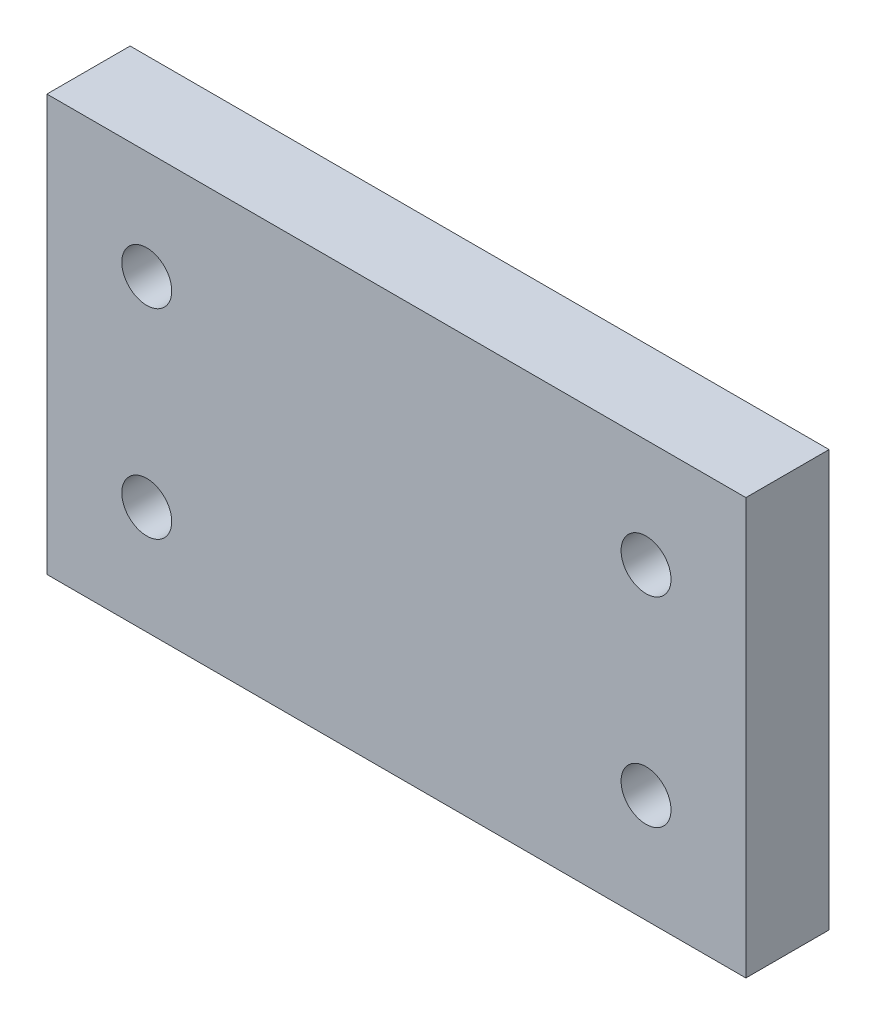
ISO-10303-21;
HEADER;
FILE_DESCRIPTION(('STEP AP214'),'2;1');
FILE_NAME('part.step','',(''),(''),'','','');
FILE_SCHEMA(('AUTOMOTIVE_DESIGN { 1 0 10303 214 1 1 1 1 }'));
ENDSEC;
DATA;
#1=APPLICATION_CONTEXT('core data for automotive mechanical design processes');
#2=APPLICATION_PROTOCOL_DEFINITION('international standard','automotive_design',2000,#1);
#3=PRODUCT_CONTEXT('',#1,'mechanical');
#4=PRODUCT('Part','Part','',(#3));
#5=PRODUCT_RELATED_PRODUCT_CATEGORY('part','',(#4));
#6=PRODUCT_DEFINITION_FORMATION('','',#4);
#7=PRODUCT_DEFINITION_CONTEXT('part definition',#1,'design');
#8=PRODUCT_DEFINITION('design','',#6,#7);
#9=PRODUCT_DEFINITION_SHAPE('','',#8);
#10=(LENGTH_UNIT() NAMED_UNIT(*) SI_UNIT(.MILLI.,.METRE.));
#11=(NAMED_UNIT(*) PLANE_ANGLE_UNIT() SI_UNIT($,.RADIAN.));
#12=(NAMED_UNIT(*) SI_UNIT($,.STERADIAN.) SOLID_ANGLE_UNIT());
#13=UNCERTAINTY_MEASURE_WITH_UNIT(LENGTH_MEASURE(1.E-05),#10,'distance_accuracy_value','');
#14=(GEOMETRIC_REPRESENTATION_CONTEXT(3) GLOBAL_UNCERTAINTY_ASSIGNED_CONTEXT((#13)) GLOBAL_UNIT_ASSIGNED_CONTEXT((#10,
#11,#12)) REPRESENTATION_CONTEXT('',''));
#15=CARTESIAN_POINT('',(0.,0.,0.));
#16=DIRECTION('',(0.,0.,1.));
#17=DIRECTION('',(1.,0.,0.));
#18=AXIS2_PLACEMENT_3D('',#15,#16,#17);
#19=CARTESIAN_POINT('',(0.,0.,5.));
#20=DIRECTION('',(0.,0.,1.));
#21=DIRECTION('',(1.,0.,0.));
#22=AXIS2_PLACEMENT_3D('',#19,#20,#21);
#23=PLANE('',#22);
#24=CARTESIAN_POINT('',(-15.,-6.,5.));
#25=DIRECTION('',(0.,0.,1.));
#26=DIRECTION('',(1.,0.,0.));
#27=AXIS2_PLACEMENT_3D('',#24,#25,#26);
#28=CIRCLE('',#27,1.5);
#29=CARTESIAN_POINT('',(-13.5,-6.,5.));
#30=VERTEX_POINT('',#29);
#31=EDGE_CURVE('E148',#30,#30,#28,.T.);
#32=ORIENTED_EDGE('',*,*,#31,.F.);
#33=EDGE_LOOP('',(#32));
#34=FACE_BOUND('',#33,.T.);
#35=CARTESIAN_POINT('',(15.,6.,5.));
#36=DIRECTION('',(0.,0.,1.));
#37=DIRECTION('',(1.,0.,0.));
#38=AXIS2_PLACEMENT_3D('',#35,#36,#37);
#39=CIRCLE('',#38,1.5);
#40=CARTESIAN_POINT('',(16.5,6.,5.));
#41=VERTEX_POINT('',#40);
#42=EDGE_CURVE('E118',#41,#41,#39,.T.);
#43=ORIENTED_EDGE('',*,*,#42,.F.);
#44=EDGE_LOOP('',(#43));
#45=FACE_BOUND('',#44,.T.);
#46=DIRECTION('',(0.,-1.,0.));
#47=VECTOR('',#46,1.);
#48=CARTESIAN_POINT('',(-21.,-12.5,5.));
#49=LINE('',#48,#47);
#50=CARTESIAN_POINT('',(-21.,12.5,5.));
#51=VERTEX_POINT('',#50);
#52=CARTESIAN_POINT('',(-21.,-12.5,5.));
#53=VERTEX_POINT('',#52);
#54=EDGE_CURVE('E98',#51,#53,#49,.T.);
#55=ORIENTED_EDGE('',*,*,#54,.T.);
#56=DIRECTION('',(1.,0.,0.));
#57=VECTOR('',#56,1.);
#58=CARTESIAN_POINT('',(21.,-12.5,5.));
#59=LINE('',#58,#57);
#60=CARTESIAN_POINT('',(21.,-12.5,5.));
#61=VERTEX_POINT('',#60);
#62=EDGE_CURVE('E93',#53,#61,#59,.T.);
#63=ORIENTED_EDGE('',*,*,#62,.T.);
#64=DIRECTION('',(0.,1.,0.));
#65=VECTOR('',#64,1.);
#66=CARTESIAN_POINT('',(21.,-12.5,5.));
#67=LINE('',#66,#65);
#68=CARTESIAN_POINT('',(21.,12.5,5.));
#69=VERTEX_POINT('',#68);
#70=EDGE_CURVE('E96',#61,#69,#67,.T.);
#71=ORIENTED_EDGE('',*,*,#70,.T.);
#72=DIRECTION('',(-1.,0.,0.));
#73=VECTOR('',#72,1.);
#74=CARTESIAN_POINT('',(21.,12.5,5.));
#75=LINE('',#74,#73);
#76=EDGE_CURVE('E63',#69,#51,#75,.T.);
#77=ORIENTED_EDGE('',*,*,#76,.T.);
#78=EDGE_LOOP('',(#55,#63,#71,#77));
#79=FACE_BOUND('',#78,.T.);
#80=CARTESIAN_POINT('',(15.,-6.,5.));
#81=DIRECTION('',(0.,0.,1.));
#82=DIRECTION('',(1.,0.,0.));
#83=AXIS2_PLACEMENT_3D('',#80,#81,#82);
#84=CIRCLE('',#83,1.5);
#85=CARTESIAN_POINT('',(16.5,-6.,5.));
#86=VERTEX_POINT('',#85);
#87=EDGE_CURVE('E140',#86,#86,#84,.T.);
#88=ORIENTED_EDGE('',*,*,#87,.F.);
#89=EDGE_LOOP('',(#88));
#90=FACE_BOUND('',#89,.T.);
#91=CARTESIAN_POINT('',(-15.,6.,5.));
#92=DIRECTION('',(0.,0.,1.));
#93=DIRECTION('',(1.,0.,0.));
#94=AXIS2_PLACEMENT_3D('',#91,#92,#93);
#95=CIRCLE('',#94,1.5);
#96=CARTESIAN_POINT('',(-13.5,6.,5.));
#97=VERTEX_POINT('',#96);
#98=EDGE_CURVE('E156',#97,#97,#95,.T.);
#99=ORIENTED_EDGE('',*,*,#98,.F.);
#100=EDGE_LOOP('',(#99));
#101=FACE_BOUND('',#100,.T.);
#102=ADVANCED_FACE('F45',(#34,#45,#79,#90,#101),#23,.T.);
#103=CARTESIAN_POINT('',(0.,0.,0.));
#104=DIRECTION('',(0.,0.,1.));
#105=DIRECTION('',(1.,0.,0.));
#106=AXIS2_PLACEMENT_3D('',#103,#104,#105);
#107=PLANE('',#106);
#108=DIRECTION('',(0.,-1.,0.));
#109=VECTOR('',#108,1.);
#110=CARTESIAN_POINT('',(-21.,-12.5,0.));
#111=LINE('',#110,#109);
#112=CARTESIAN_POINT('',(-21.,12.5,0.));
#113=VERTEX_POINT('',#112);
#114=CARTESIAN_POINT('',(-21.,-12.5,0.));
#115=VERTEX_POINT('',#114);
#116=EDGE_CURVE('E114',#113,#115,#111,.T.);
#117=ORIENTED_EDGE('',*,*,#116,.F.);
#118=DIRECTION('',(-1.,0.,0.));
#119=VECTOR('',#118,1.);
#120=CARTESIAN_POINT('',(21.,12.5,0.));
#121=LINE('',#120,#119);
#122=CARTESIAN_POINT('',(21.,12.5,0.));
#123=VERTEX_POINT('',#122);
#124=EDGE_CURVE('E86',#123,#113,#121,.T.);
#125=ORIENTED_EDGE('',*,*,#124,.F.);
#126=DIRECTION('',(0.,1.,0.));
#127=VECTOR('',#126,1.);
#128=CARTESIAN_POINT('',(21.,-12.5,0.));
#129=LINE('',#128,#127);
#130=CARTESIAN_POINT('',(21.,-12.5,0.));
#131=VERTEX_POINT('',#130);
#132=EDGE_CURVE('E80',#131,#123,#129,.T.);
#133=ORIENTED_EDGE('',*,*,#132,.F.);
#134=DIRECTION('',(1.,0.,0.));
#135=VECTOR('',#134,1.);
#136=CARTESIAN_POINT('',(21.,-12.5,0.));
#137=LINE('',#136,#135);
#138=EDGE_CURVE('E103',#115,#131,#137,.T.);
#139=ORIENTED_EDGE('',*,*,#138,.F.);
#140=EDGE_LOOP('',(#117,#125,#133,#139));
#141=FACE_BOUND('',#140,.T.);
#142=CARTESIAN_POINT('',(15.,6.,0.));
#143=DIRECTION('',(0.,0.,1.));
#144=DIRECTION('',(1.,0.,0.));
#145=AXIS2_PLACEMENT_3D('',#142,#143,#144);
#146=CIRCLE('',#145,1.5);
#147=CARTESIAN_POINT('',(16.5,6.,0.));
#148=VERTEX_POINT('',#147);
#149=EDGE_CURVE('E136',#148,#148,#146,.T.);
#150=ORIENTED_EDGE('',*,*,#149,.T.);
#151=EDGE_LOOP('',(#150));
#152=FACE_BOUND('',#151,.T.);
#153=CARTESIAN_POINT('',(15.,-6.,0.));
#154=DIRECTION('',(0.,0.,1.));
#155=DIRECTION('',(1.,0.,0.));
#156=AXIS2_PLACEMENT_3D('',#153,#154,#155);
#157=CIRCLE('',#156,1.5);
#158=CARTESIAN_POINT('',(16.5,-6.,0.));
#159=VERTEX_POINT('',#158);
#160=EDGE_CURVE('E144',#159,#159,#157,.T.);
#161=ORIENTED_EDGE('',*,*,#160,.T.);
#162=EDGE_LOOP('',(#161));
#163=FACE_BOUND('',#162,.T.);
#164=CARTESIAN_POINT('',(-15.,-6.,0.));
#165=DIRECTION('',(0.,0.,1.));
#166=DIRECTION('',(1.,0.,0.));
#167=AXIS2_PLACEMENT_3D('',#164,#165,#166);
#168=CIRCLE('',#167,1.5);
#169=CARTESIAN_POINT('',(-13.5,-6.,0.));
#170=VERTEX_POINT('',#169);
#171=EDGE_CURVE('E152',#170,#170,#168,.T.);
#172=ORIENTED_EDGE('',*,*,#171,.T.);
#173=EDGE_LOOP('',(#172));
#174=FACE_BOUND('',#173,.T.);
#175=CARTESIAN_POINT('',(-15.,6.,0.));
#176=DIRECTION('',(0.,0.,1.));
#177=DIRECTION('',(1.,0.,0.));
#178=AXIS2_PLACEMENT_3D('',#175,#176,#177);
#179=CIRCLE('',#178,1.5);
#180=CARTESIAN_POINT('',(-13.5,6.,0.));
#181=VERTEX_POINT('',#180);
#182=EDGE_CURVE('E160',#181,#181,#179,.T.);
#183=ORIENTED_EDGE('',*,*,#182,.T.);
#184=EDGE_LOOP('',(#183));
#185=FACE_BOUND('',#184,.T.);
#186=ADVANCED_FACE('F131',(#141,#152,#163,#174,#185),#107,.F.);
#187=CARTESIAN_POINT('',(-21.,-12.5,5.));
#188=DIRECTION('',(1.,0.,0.));
#189=DIRECTION('',(0.,0.,-1.));
#190=AXIS2_PLACEMENT_3D('',#187,#188,#189);
#191=PLANE('',#190);
#192=ORIENTED_EDGE('',*,*,#116,.T.);
#193=DIRECTION('',(0.,0.,-1.));
#194=VECTOR('',#193,1.);
#195=CARTESIAN_POINT('',(-21.,-12.5,5.));
#196=LINE('',#195,#194);
#197=EDGE_CURVE('E11',#53,#115,#196,.T.);
#198=ORIENTED_EDGE('',*,*,#197,.F.);
#199=ORIENTED_EDGE('',*,*,#54,.F.);
#200=DIRECTION('',(0.,0.,-1.));
#201=VECTOR('',#200,1.);
#202=CARTESIAN_POINT('',(-21.,12.5,5.));
#203=LINE('',#202,#201);
#204=EDGE_CURVE('E110',#51,#113,#203,.T.);
#205=ORIENTED_EDGE('',*,*,#204,.T.);
#206=EDGE_LOOP('',(#192,#198,#199,#205));
#207=FACE_BOUND('',#206,.T.);
#208=ADVANCED_FACE('F47',(#207),#191,.F.);
#209=CARTESIAN_POINT('',(21.,-12.5,5.));
#210=DIRECTION('',(0.,1.,0.));
#211=DIRECTION('',(-1.,0.,0.));
#212=AXIS2_PLACEMENT_3D('',#209,#210,#211);
#213=PLANE('',#212);
#214=ORIENTED_EDGE('',*,*,#138,.T.);
#215=DIRECTION('',(0.,0.,-1.));
#216=VECTOR('',#215,1.);
#217=CARTESIAN_POINT('',(21.,-12.5,5.));
#218=LINE('',#217,#216);
#219=EDGE_CURVE('E55',#61,#131,#218,.T.);
#220=ORIENTED_EDGE('',*,*,#219,.F.);
#221=ORIENTED_EDGE('',*,*,#62,.F.);
#222=ORIENTED_EDGE('',*,*,#197,.T.);
#223=EDGE_LOOP('',(#214,#220,#221,#222));
#224=FACE_BOUND('',#223,.T.);
#225=ADVANCED_FACE('F102',(#224),#213,.F.);
#226=CARTESIAN_POINT('',(21.,-12.5,5.));
#227=DIRECTION('',(-1.,0.,0.));
#228=DIRECTION('',(0.,0.,1.));
#229=AXIS2_PLACEMENT_3D('',#226,#227,#228);
#230=PLANE('',#229);
#231=ORIENTED_EDGE('',*,*,#132,.T.);
#232=DIRECTION('',(0.,0.,-1.));
#233=VECTOR('',#232,1.);
#234=CARTESIAN_POINT('',(21.,12.5,5.));
#235=LINE('',#234,#233);
#236=EDGE_CURVE('E105',#69,#123,#235,.T.);
#237=ORIENTED_EDGE('',*,*,#236,.F.);
#238=ORIENTED_EDGE('',*,*,#70,.F.);
#239=ORIENTED_EDGE('',*,*,#219,.T.);
#240=EDGE_LOOP('',(#231,#237,#238,#239));
#241=FACE_BOUND('',#240,.T.);
#242=ADVANCED_FACE('F106',(#241),#230,.F.);
#243=CARTESIAN_POINT('',(21.,12.5,5.));
#244=DIRECTION('',(0.,-1.,0.));
#245=DIRECTION('',(1.,0.,0.));
#246=AXIS2_PLACEMENT_3D('',#243,#244,#245);
#247=PLANE('',#246);
#248=ORIENTED_EDGE('',*,*,#124,.T.);
#249=ORIENTED_EDGE('',*,*,#204,.F.);
#250=ORIENTED_EDGE('',*,*,#76,.F.);
#251=ORIENTED_EDGE('',*,*,#236,.T.);
#252=EDGE_LOOP('',(#248,#249,#250,#251));
#253=FACE_BOUND('',#252,.T.);
#254=ADVANCED_FACE('F128',(#253),#247,.F.);
#255=CARTESIAN_POINT('',(15.,6.,5.));
#256=DIRECTION('',(0.,0.,-1.));
#257=DIRECTION('',(-1.,0.,0.));
#258=AXIS2_PLACEMENT_3D('',#255,#256,#257);
#259=CYLINDRICAL_SURFACE('',#258,1.5);
#260=ORIENTED_EDGE('',*,*,#42,.T.);
#261=EDGE_LOOP('',(#260));
#262=FACE_BOUND('',#261,.T.);
#263=ORIENTED_EDGE('',*,*,#149,.F.);
#264=EDGE_LOOP('',(#263));
#265=FACE_BOUND('',#264,.T.);
#266=ADVANCED_FACE('F181',(#262,#265),#259,.F.);
#267=CARTESIAN_POINT('',(15.,-6.,5.));
#268=DIRECTION('',(0.,0.,-1.));
#269=DIRECTION('',(-1.,0.,0.));
#270=AXIS2_PLACEMENT_3D('',#267,#268,#269);
#271=CYLINDRICAL_SURFACE('',#270,1.5);
#272=ORIENTED_EDGE('',*,*,#87,.T.);
#273=EDGE_LOOP('',(#272));
#274=FACE_BOUND('',#273,.T.);
#275=ORIENTED_EDGE('',*,*,#160,.F.);
#276=EDGE_LOOP('',(#275));
#277=FACE_BOUND('',#276,.T.);
#278=ADVANCED_FACE('F226',(#274,#277),#271,.F.);
#279=CARTESIAN_POINT('',(-15.,-6.,5.));
#280=DIRECTION('',(0.,0.,-1.));
#281=DIRECTION('',(-1.,0.,0.));
#282=AXIS2_PLACEMENT_3D('',#279,#280,#281);
#283=CYLINDRICAL_SURFACE('',#282,1.5);
#284=ORIENTED_EDGE('',*,*,#31,.T.);
#285=EDGE_LOOP('',(#284));
#286=FACE_BOUND('',#285,.T.);
#287=ORIENTED_EDGE('',*,*,#171,.F.);
#288=EDGE_LOOP('',(#287));
#289=FACE_BOUND('',#288,.T.);
#290=ADVANCED_FACE('F234',(#286,#289),#283,.F.);
#291=CARTESIAN_POINT('',(-15.,6.,5.));
#292=DIRECTION('',(0.,0.,-1.));
#293=DIRECTION('',(-1.,0.,0.));
#294=AXIS2_PLACEMENT_3D('',#291,#292,#293);
#295=CYLINDRICAL_SURFACE('',#294,1.5);
#296=ORIENTED_EDGE('',*,*,#98,.T.);
#297=EDGE_LOOP('',(#296));
#298=FACE_BOUND('',#297,.T.);
#299=ORIENTED_EDGE('',*,*,#182,.F.);
#300=EDGE_LOOP('',(#299));
#301=FACE_BOUND('',#300,.T.);
#302=ADVANCED_FACE('F168',(#298,#301),#295,.F.);
#303=CLOSED_SHELL('',(#102,#186,#208,#225,#242,#254,#266,#278,#290,#302));
#304=MANIFOLD_SOLID_BREP('B2',#303);
#305=ADVANCED_BREP_SHAPE_REPRESENTATION('',(#18,#304),#14);
#306=SHAPE_DEFINITION_REPRESENTATION(#9,#305);
ENDSEC;
END-ISO-10303-21;
